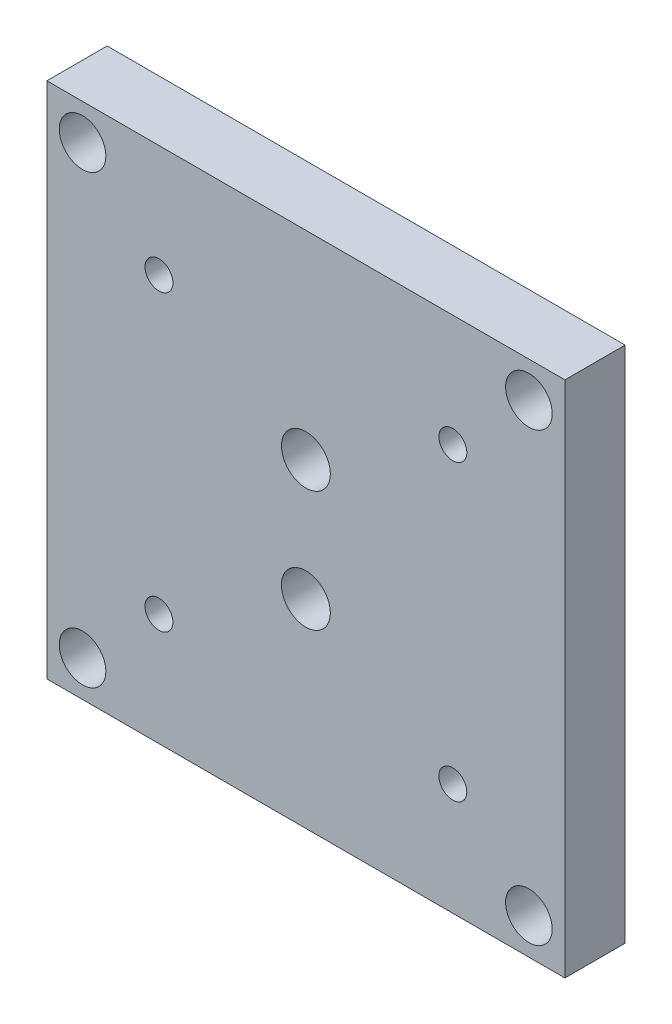
ISO-10303-21;
HEADER;
FILE_DESCRIPTION(('STEP AP214'),'2;1');
FILE_NAME('part.step','',(''),(''),'','','');
FILE_SCHEMA(('AUTOMOTIVE_DESIGN { 1 0 10303 214 1 1 1 1 }'));
ENDSEC;
DATA;
#1=APPLICATION_CONTEXT('core data for automotive mechanical design processes');
#2=APPLICATION_PROTOCOL_DEFINITION('international standard','automotive_design',2000,#1);
#3=PRODUCT_CONTEXT('',#1,'mechanical');
#4=PRODUCT('Part','Part','',(#3));
#5=PRODUCT_RELATED_PRODUCT_CATEGORY('part','',(#4));
#6=PRODUCT_DEFINITION_FORMATION('','',#4);
#7=PRODUCT_DEFINITION_CONTEXT('part definition',#1,'design');
#8=PRODUCT_DEFINITION('design','',#6,#7);
#9=PRODUCT_DEFINITION_SHAPE('','',#8);
#10=(LENGTH_UNIT() NAMED_UNIT(*) SI_UNIT(.MILLI.,.METRE.));
#11=(NAMED_UNIT(*) PLANE_ANGLE_UNIT() SI_UNIT($,.RADIAN.));
#12=(NAMED_UNIT(*) SI_UNIT($,.STERADIAN.) SOLID_ANGLE_UNIT());
#13=UNCERTAINTY_MEASURE_WITH_UNIT(LENGTH_MEASURE(1.E-05),#10,'distance_accuracy_value','');
#14=(GEOMETRIC_REPRESENTATION_CONTEXT(3) GLOBAL_UNCERTAINTY_ASSIGNED_CONTEXT((#13)) GLOBAL_UNIT_ASSIGNED_CONTEXT((#10,
#11,#12)) REPRESENTATION_CONTEXT('',''));
#15=CARTESIAN_POINT('',(0.,0.,0.));
#16=DIRECTION('',(0.,0.,1.));
#17=DIRECTION('',(1.,0.,0.));
#18=AXIS2_PLACEMENT_3D('',#15,#16,#17);
#19=CARTESIAN_POINT('',(-27.305,27.305,6.35));
#20=DIRECTION('',(1.,0.,0.));
#21=DIRECTION('',(0.,0.,-1.));
#22=AXIS2_PLACEMENT_3D('',#19,#20,#21);
#23=PLANE('',#22);
#24=DIRECTION('',(0.,-1.,0.));
#25=VECTOR('',#24,1.);
#26=CARTESIAN_POINT('',(-27.305,27.305,0.));
#27=LINE('',#26,#25);
#28=CARTESIAN_POINT('',(-27.305,27.305,0.));
#29=VERTEX_POINT('',#28);
#30=CARTESIAN_POINT('',(-27.305,-27.305,0.));
#31=VERTEX_POINT('',#30);
#32=EDGE_CURVE('E95',#29,#31,#27,.T.);
#33=ORIENTED_EDGE('',*,*,#32,.T.);
#34=DIRECTION('',(0.,0.,-1.));
#35=VECTOR('',#34,1.);
#36=CARTESIAN_POINT('',(-27.305,-27.305,6.35));
#37=LINE('',#36,#35);
#38=CARTESIAN_POINT('',(-27.305,-27.305,6.35));
#39=VERTEX_POINT('',#38);
#40=EDGE_CURVE('E11',#39,#31,#37,.T.);
#41=ORIENTED_EDGE('',*,*,#40,.F.);
#42=DIRECTION('',(0.,-1.,0.));
#43=VECTOR('',#42,1.);
#44=CARTESIAN_POINT('',(-27.305,27.305,6.35));
#45=LINE('',#44,#43);
#46=CARTESIAN_POINT('',(-27.305,27.305,6.35));
#47=VERTEX_POINT('',#46);
#48=EDGE_CURVE('E83',#47,#39,#45,.T.);
#49=ORIENTED_EDGE('',*,*,#48,.F.);
#50=DIRECTION('',(0.,0.,-1.));
#51=VECTOR('',#50,1.);
#52=CARTESIAN_POINT('',(-27.305,27.305,6.35));
#53=LINE('',#52,#51);
#54=EDGE_CURVE('E91',#47,#29,#53,.T.);
#55=ORIENTED_EDGE('',*,*,#54,.T.);
#56=EDGE_LOOP('',(#33,#41,#49,#55));
#57=FACE_BOUND('',#56,.T.);
#58=ADVANCED_FACE('F32',(#57),#23,.F.);
#59=CARTESIAN_POINT('',(-27.305,-27.305,6.35));
#60=DIRECTION('',(0.,1.,0.));
#61=DIRECTION('',(0.,0.,1.));
#62=AXIS2_PLACEMENT_3D('',#59,#60,#61);
#63=PLANE('',#62);
#64=DIRECTION('',(1.,0.,0.));
#65=VECTOR('',#64,1.);
#66=CARTESIAN_POINT('',(-27.305,-27.305,0.));
#67=LINE('',#66,#65);
#68=CARTESIAN_POINT('',(27.305,-27.305,0.));
#69=VERTEX_POINT('',#68);
#70=EDGE_CURVE('E87',#31,#69,#67,.T.);
#71=ORIENTED_EDGE('',*,*,#70,.T.);
#72=DIRECTION('',(0.,0.,-1.));
#73=VECTOR('',#72,1.);
#74=CARTESIAN_POINT('',(27.305,-27.305,6.35));
#75=LINE('',#74,#73);
#76=CARTESIAN_POINT('',(27.305,-27.305,6.35));
#77=VERTEX_POINT('',#76);
#78=EDGE_CURVE('E40',#77,#69,#75,.T.);
#79=ORIENTED_EDGE('',*,*,#78,.F.);
#80=DIRECTION('',(1.,0.,0.));
#81=VECTOR('',#80,1.);
#82=CARTESIAN_POINT('',(-27.305,-27.305,6.35));
#83=LINE('',#82,#81);
#84=EDGE_CURVE('E78',#39,#77,#83,.T.);
#85=ORIENTED_EDGE('',*,*,#84,.F.);
#86=ORIENTED_EDGE('',*,*,#40,.T.);
#87=EDGE_LOOP('',(#71,#79,#85,#86));
#88=FACE_BOUND('',#87,.T.);
#89=ADVANCED_FACE('F86',(#88),#63,.F.);
#90=CARTESIAN_POINT('',(27.305,27.305,6.35));
#91=DIRECTION('',(-1.,0.,0.));
#92=DIRECTION('',(0.,0.,1.));
#93=AXIS2_PLACEMENT_3D('',#90,#91,#92);
#94=PLANE('',#93);
#95=DIRECTION('',(0.,1.,0.));
#96=VECTOR('',#95,1.);
#97=CARTESIAN_POINT('',(27.305,27.305,0.));
#98=LINE('',#97,#96);
#99=CARTESIAN_POINT('',(27.305,27.305,0.));
#100=VERTEX_POINT('',#99);
#101=EDGE_CURVE('E65',#69,#100,#98,.T.);
#102=ORIENTED_EDGE('',*,*,#101,.T.);
#103=DIRECTION('',(0.,0.,-1.));
#104=VECTOR('',#103,1.);
#105=CARTESIAN_POINT('',(27.305,27.305,6.35));
#106=LINE('',#105,#104);
#107=CARTESIAN_POINT('',(27.305,27.305,6.35));
#108=VERTEX_POINT('',#107);
#109=EDGE_CURVE('E88',#108,#100,#106,.T.);
#110=ORIENTED_EDGE('',*,*,#109,.F.);
#111=DIRECTION('',(0.,1.,0.));
#112=VECTOR('',#111,1.);
#113=CARTESIAN_POINT('',(27.305,27.305,6.35));
#114=LINE('',#113,#112);
#115=EDGE_CURVE('E81',#77,#108,#114,.T.);
#116=ORIENTED_EDGE('',*,*,#115,.F.);
#117=ORIENTED_EDGE('',*,*,#78,.T.);
#118=EDGE_LOOP('',(#102,#110,#116,#117));
#119=FACE_BOUND('',#118,.T.);
#120=ADVANCED_FACE('F89',(#119),#94,.F.);
#121=CARTESIAN_POINT('',(-27.305,27.305,6.35));
#122=DIRECTION('',(0.,-1.,0.));
#123=DIRECTION('',(0.,0.,-1.));
#124=AXIS2_PLACEMENT_3D('',#121,#122,#123);
#125=PLANE('',#124);
#126=DIRECTION('',(-1.,0.,0.));
#127=VECTOR('',#126,1.);
#128=CARTESIAN_POINT('',(-27.305,27.305,0.));
#129=LINE('',#128,#127);
#130=EDGE_CURVE('E71',#100,#29,#129,.T.);
#131=ORIENTED_EDGE('',*,*,#130,.T.);
#132=ORIENTED_EDGE('',*,*,#54,.F.);
#133=DIRECTION('',(-1.,0.,0.));
#134=VECTOR('',#133,1.);
#135=CARTESIAN_POINT('',(-27.305,27.305,6.35));
#136=LINE('',#135,#134);
#137=EDGE_CURVE('E48',#108,#47,#136,.T.);
#138=ORIENTED_EDGE('',*,*,#137,.F.);
#139=ORIENTED_EDGE('',*,*,#109,.T.);
#140=EDGE_LOOP('',(#131,#132,#138,#139));
#141=FACE_BOUND('',#140,.T.);
#142=ADVANCED_FACE('F103',(#141),#125,.F.);
#143=CARTESIAN_POINT('',(0.,0.,6.35));
#144=DIRECTION('',(0.,0.,1.));
#145=DIRECTION('',(1.,0.,0.));
#146=AXIS2_PLACEMENT_3D('',#143,#144,#145);
#147=PLANE('',#146);
#148=CARTESIAN_POINT('',(0.,-6.35,6.35));
#149=DIRECTION('',(0.,0.,1.));
#150=DIRECTION('',(1.,0.,0.));
#151=AXIS2_PLACEMENT_3D('',#148,#149,#150);
#152=CIRCLE('',#151,2.5781);
#153=CARTESIAN_POINT('',(2.5781,-6.35,6.35));
#154=VERTEX_POINT('',#153);
#155=EDGE_CURVE('E160',#154,#154,#152,.T.);
#156=ORIENTED_EDGE('',*,*,#155,.F.);
#157=EDGE_LOOP('',(#156));
#158=FACE_BOUND('',#157,.T.);
#159=CARTESIAN_POINT('',(0.,6.35,6.35));
#160=DIRECTION('',(0.,0.,1.));
#161=DIRECTION('',(1.,0.,0.));
#162=AXIS2_PLACEMENT_3D('',#159,#160,#161);
#163=CIRCLE('',#162,2.5781);
#164=CARTESIAN_POINT('',(2.5781,6.35,6.35));
#165=VERTEX_POINT('',#164);
#166=EDGE_CURVE('E156',#165,#165,#163,.T.);
#167=ORIENTED_EDGE('',*,*,#166,.F.);
#168=EDGE_LOOP('',(#167));
#169=FACE_BOUND('',#168,.T.);
#170=CARTESIAN_POINT('',(-15.4878830138273,15.494,6.35));
#171=DIRECTION('',(0.,0.,1.));
#172=DIRECTION('',(1.,0.,0.));
#173=AXIS2_PLACEMENT_3D('',#170,#171,#172);
#174=CIRCLE('',#173,1.4732);
#175=CARTESIAN_POINT('',(-14.0146830138273,15.494,6.35));
#176=VERTEX_POINT('',#175);
#177=EDGE_CURVE('E153',#176,#176,#174,.T.);
#178=ORIENTED_EDGE('',*,*,#177,.F.);
#179=EDGE_LOOP('',(#178));
#180=FACE_BOUND('',#179,.T.);
#181=CARTESIAN_POINT('',(15.494,15.4878830138273,6.35));
#182=DIRECTION('',(0.,0.,1.));
#183=DIRECTION('',(1.,0.,0.));
#184=AXIS2_PLACEMENT_3D('',#181,#182,#183);
#185=CIRCLE('',#184,1.4732);
#186=CARTESIAN_POINT('',(16.9672,15.4878830138273,6.35));
#187=VERTEX_POINT('',#186);
#188=EDGE_CURVE('E147',#187,#187,#185,.T.);
#189=ORIENTED_EDGE('',*,*,#188,.F.);
#190=EDGE_LOOP('',(#189));
#191=FACE_BOUND('',#190,.T.);
#192=CARTESIAN_POINT('',(15.4878830138273,-15.494,6.35));
#193=DIRECTION('',(0.,0.,1.));
#194=DIRECTION('',(1.,0.,0.));
#195=AXIS2_PLACEMENT_3D('',#192,#193,#194);
#196=CIRCLE('',#195,1.4732);
#197=CARTESIAN_POINT('',(16.9610830138273,-15.494,6.35));
#198=VERTEX_POINT('',#197);
#199=EDGE_CURVE('E141',#198,#198,#196,.T.);
#200=ORIENTED_EDGE('',*,*,#199,.F.);
#201=EDGE_LOOP('',(#200));
#202=FACE_BOUND('',#201,.T.);
#203=CARTESIAN_POINT('',(-15.494,-15.4878830138273,6.35));
#204=DIRECTION('',(0.,0.,1.));
#205=DIRECTION('',(1.,0.,0.));
#206=AXIS2_PLACEMENT_3D('',#203,#204,#205);
#207=CIRCLE('',#206,1.4732);
#208=CARTESIAN_POINT('',(-14.0208,-15.4878830138273,6.35));
#209=VERTEX_POINT('',#208);
#210=EDGE_CURVE('E135',#209,#209,#207,.T.);
#211=ORIENTED_EDGE('',*,*,#210,.F.);
#212=EDGE_LOOP('',(#211));
#213=FACE_BOUND('',#212,.T.);
#214=CARTESIAN_POINT('',(-23.5458,23.5458,6.35));
#215=DIRECTION('',(0.,0.,1.));
#216=DIRECTION('',(1.,0.,0.));
#217=AXIS2_PLACEMENT_3D('',#214,#215,#216);
#218=CIRCLE('',#217,2.45745);
#219=CARTESIAN_POINT('',(-21.08835,23.5458,6.35));
#220=VERTEX_POINT('',#219);
#221=EDGE_CURVE('E129',#220,#220,#218,.T.);
#222=ORIENTED_EDGE('',*,*,#221,.F.);
#223=EDGE_LOOP('',(#222));
#224=FACE_BOUND('',#223,.T.);
#225=CARTESIAN_POINT('',(23.5107420744024,23.5458000000026,6.35));
#226=DIRECTION('',(0.,0.,1.));
#227=DIRECTION('',(1.,0.,0.));
#228=AXIS2_PLACEMENT_3D('',#225,#226,#227);
#229=CIRCLE('',#228,2.45745);
#230=CARTESIAN_POINT('',(25.9681920744024,23.5458000000026,6.35));
#231=VERTEX_POINT('',#230);
#232=EDGE_CURVE('E123',#231,#231,#229,.T.);
#233=ORIENTED_EDGE('',*,*,#232,.F.);
#234=EDGE_LOOP('',(#233));
#235=FACE_BOUND('',#234,.T.);
#236=CARTESIAN_POINT('',(23.5107420744049,-23.5107420743998,6.35));
#237=DIRECTION('',(0.,0.,1.));
#238=DIRECTION('',(1.,0.,0.));
#239=AXIS2_PLACEMENT_3D('',#236,#237,#238);
#240=CIRCLE('',#239,2.45745);
#241=CARTESIAN_POINT('',(25.9681920744049,-23.5107420743998,6.35));
#242=VERTEX_POINT('',#241);
#243=EDGE_CURVE('E117',#242,#242,#240,.T.);
#244=ORIENTED_EDGE('',*,*,#243,.F.);
#245=EDGE_LOOP('',(#244));
#246=FACE_BOUND('',#245,.T.);
#247=CARTESIAN_POINT('',(-23.5457999999976,-23.5107420744021,6.35));
#248=DIRECTION('',(0.,0.,1.));
#249=DIRECTION('',(1.,0.,0.));
#250=AXIS2_PLACEMENT_3D('',#247,#248,#249);
#251=CIRCLE('',#250,2.45745);
#252=CARTESIAN_POINT('',(-21.0883499999976,-23.5107420744021,6.35));
#253=VERTEX_POINT('',#252);
#254=EDGE_CURVE('E111',#253,#253,#251,.T.);
#255=ORIENTED_EDGE('',*,*,#254,.F.);
#256=EDGE_LOOP('',(#255));
#257=FACE_BOUND('',#256,.T.);
#258=ORIENTED_EDGE('',*,*,#48,.T.);
#259=ORIENTED_EDGE('',*,*,#84,.T.);
#260=ORIENTED_EDGE('',*,*,#115,.T.);
#261=ORIENTED_EDGE('',*,*,#137,.T.);
#262=EDGE_LOOP('',(#258,#259,#260,#261));
#263=FACE_BOUND('',#262,.T.);
#264=ADVANCED_FACE('F79',(#158,#169,#180,#191,#202,#213,#224,#235,#246,#257,#263),#147,.T.);
#265=CARTESIAN_POINT('',(0.,0.,0.));
#266=DIRECTION('',(0.,0.,1.));
#267=DIRECTION('',(1.,0.,0.));
#268=AXIS2_PLACEMENT_3D('',#265,#266,#267);
#269=PLANE('',#268);
#270=CARTESIAN_POINT('',(0.,-6.35,0.));
#271=DIRECTION('',(0.,0.,1.));
#272=DIRECTION('',(1.,0.,0.));
#273=AXIS2_PLACEMENT_3D('',#270,#271,#272);
#274=CIRCLE('',#273,2.5781);
#275=CARTESIAN_POINT('',(2.5781,-6.35,0.));
#276=VERTEX_POINT('',#275);
#277=EDGE_CURVE('E163',#276,#276,#274,.T.);
#278=ORIENTED_EDGE('',*,*,#277,.T.);
#279=EDGE_LOOP('',(#278));
#280=FACE_BOUND('',#279,.T.);
#281=CARTESIAN_POINT('',(0.,6.35,0.));
#282=DIRECTION('',(0.,0.,1.));
#283=DIRECTION('',(1.,0.,0.));
#284=AXIS2_PLACEMENT_3D('',#281,#282,#283);
#285=CIRCLE('',#284,2.5781);
#286=CARTESIAN_POINT('',(2.5781,6.35,0.));
#287=VERTEX_POINT('',#286);
#288=EDGE_CURVE('E157',#287,#287,#285,.T.);
#289=ORIENTED_EDGE('',*,*,#288,.T.);
#290=EDGE_LOOP('',(#289));
#291=FACE_BOUND('',#290,.T.);
#292=CARTESIAN_POINT('',(-15.4878830138273,15.494,0.));
#293=DIRECTION('',(0.,0.,1.));
#294=DIRECTION('',(1.,0.,0.));
#295=AXIS2_PLACEMENT_3D('',#292,#293,#294);
#296=CIRCLE('',#295,1.4732);
#297=CARTESIAN_POINT('',(-14.0146830138273,15.494,0.));
#298=VERTEX_POINT('',#297);
#299=EDGE_CURVE('E150',#298,#298,#296,.T.);
#300=ORIENTED_EDGE('',*,*,#299,.T.);
#301=EDGE_LOOP('',(#300));
#302=FACE_BOUND('',#301,.T.);
#303=CARTESIAN_POINT('',(15.494,15.4878830138273,0.));
#304=DIRECTION('',(0.,0.,1.));
#305=DIRECTION('',(1.,0.,0.));
#306=AXIS2_PLACEMENT_3D('',#303,#304,#305);
#307=CIRCLE('',#306,1.4732);
#308=CARTESIAN_POINT('',(16.9672,15.4878830138273,0.));
#309=VERTEX_POINT('',#308);
#310=EDGE_CURVE('E144',#309,#309,#307,.T.);
#311=ORIENTED_EDGE('',*,*,#310,.T.);
#312=EDGE_LOOP('',(#311));
#313=FACE_BOUND('',#312,.T.);
#314=CARTESIAN_POINT('',(15.4878830138273,-15.494,0.));
#315=DIRECTION('',(0.,0.,1.));
#316=DIRECTION('',(1.,0.,0.));
#317=AXIS2_PLACEMENT_3D('',#314,#315,#316);
#318=CIRCLE('',#317,1.4732);
#319=CARTESIAN_POINT('',(16.9610830138273,-15.494,0.));
#320=VERTEX_POINT('',#319);
#321=EDGE_CURVE('E138',#320,#320,#318,.T.);
#322=ORIENTED_EDGE('',*,*,#321,.T.);
#323=EDGE_LOOP('',(#322));
#324=FACE_BOUND('',#323,.T.);
#325=CARTESIAN_POINT('',(-15.494,-15.4878830138273,0.));
#326=DIRECTION('',(0.,0.,1.));
#327=DIRECTION('',(1.,0.,0.));
#328=AXIS2_PLACEMENT_3D('',#325,#326,#327);
#329=CIRCLE('',#328,1.4732);
#330=CARTESIAN_POINT('',(-14.0208,-15.4878830138273,0.));
#331=VERTEX_POINT('',#330);
#332=EDGE_CURVE('E132',#331,#331,#329,.T.);
#333=ORIENTED_EDGE('',*,*,#332,.T.);
#334=EDGE_LOOP('',(#333));
#335=FACE_BOUND('',#334,.T.);
#336=CARTESIAN_POINT('',(-23.5458,23.5458,0.));
#337=DIRECTION('',(0.,0.,1.));
#338=DIRECTION('',(1.,0.,0.));
#339=AXIS2_PLACEMENT_3D('',#336,#337,#338);
#340=CIRCLE('',#339,2.45745);
#341=CARTESIAN_POINT('',(-21.08835,23.5458,0.));
#342=VERTEX_POINT('',#341);
#343=EDGE_CURVE('E126',#342,#342,#340,.T.);
#344=ORIENTED_EDGE('',*,*,#343,.T.);
#345=EDGE_LOOP('',(#344));
#346=FACE_BOUND('',#345,.T.);
#347=CARTESIAN_POINT('',(23.5107420744024,23.5458000000026,0.));
#348=DIRECTION('',(0.,0.,1.));
#349=DIRECTION('',(1.,0.,0.));
#350=AXIS2_PLACEMENT_3D('',#347,#348,#349);
#351=CIRCLE('',#350,2.45745);
#352=CARTESIAN_POINT('',(25.9681920744024,23.5458000000026,0.));
#353=VERTEX_POINT('',#352);
#354=EDGE_CURVE('E120',#353,#353,#351,.T.);
#355=ORIENTED_EDGE('',*,*,#354,.T.);
#356=EDGE_LOOP('',(#355));
#357=FACE_BOUND('',#356,.T.);
#358=CARTESIAN_POINT('',(23.5107420744049,-23.5107420743998,0.));
#359=DIRECTION('',(0.,0.,1.));
#360=DIRECTION('',(1.,0.,0.));
#361=AXIS2_PLACEMENT_3D('',#358,#359,#360);
#362=CIRCLE('',#361,2.45745);
#363=CARTESIAN_POINT('',(25.9681920744049,-23.5107420743998,0.));
#364=VERTEX_POINT('',#363);
#365=EDGE_CURVE('E114',#364,#364,#362,.T.);
#366=ORIENTED_EDGE('',*,*,#365,.T.);
#367=EDGE_LOOP('',(#366));
#368=FACE_BOUND('',#367,.T.);
#369=CARTESIAN_POINT('',(-23.5457999999976,-23.5107420744021,0.));
#370=DIRECTION('',(0.,0.,1.));
#371=DIRECTION('',(1.,0.,0.));
#372=AXIS2_PLACEMENT_3D('',#369,#370,#371);
#373=CIRCLE('',#372,2.45745);
#374=CARTESIAN_POINT('',(-21.0883499999976,-23.5107420744021,0.));
#375=VERTEX_POINT('',#374);
#376=EDGE_CURVE('E98',#375,#375,#373,.T.);
#377=ORIENTED_EDGE('',*,*,#376,.T.);
#378=EDGE_LOOP('',(#377));
#379=FACE_BOUND('',#378,.T.);
#380=ORIENTED_EDGE('',*,*,#32,.F.);
#381=ORIENTED_EDGE('',*,*,#130,.F.);
#382=ORIENTED_EDGE('',*,*,#101,.F.);
#383=ORIENTED_EDGE('',*,*,#70,.F.);
#384=EDGE_LOOP('',(#380,#381,#382,#383));
#385=FACE_BOUND('',#384,.T.);
#386=ADVANCED_FACE('F106',(#280,#291,#302,#313,#324,#335,#346,#357,#368,#379,#385),#269,.F.);
#387=CARTESIAN_POINT('',(-23.5457999999976,-23.5107420744021,6.35));
#388=DIRECTION('',(0.,0.,1.));
#389=DIRECTION('',(1.,0.,0.));
#390=AXIS2_PLACEMENT_3D('',#387,#388,#389);
#391=CYLINDRICAL_SURFACE('',#390,2.45745);
#392=ORIENTED_EDGE('',*,*,#376,.F.);
#393=EDGE_LOOP('',(#392));
#394=FACE_BOUND('',#393,.T.);
#395=ORIENTED_EDGE('',*,*,#254,.T.);
#396=EDGE_LOOP('',(#395));
#397=FACE_BOUND('',#396,.T.);
#398=ADVANCED_FACE('F193',(#394,#397),#391,.F.);
#399=CARTESIAN_POINT('',(23.5107420744049,-23.5107420743998,6.35));
#400=DIRECTION('',(0.,0.,1.));
#401=DIRECTION('',(1.,0.,0.));
#402=AXIS2_PLACEMENT_3D('',#399,#400,#401);
#403=CYLINDRICAL_SURFACE('',#402,2.45745);
#404=ORIENTED_EDGE('',*,*,#365,.F.);
#405=EDGE_LOOP('',(#404));
#406=FACE_BOUND('',#405,.T.);
#407=ORIENTED_EDGE('',*,*,#243,.T.);
#408=EDGE_LOOP('',(#407));
#409=FACE_BOUND('',#408,.T.);
#410=ADVANCED_FACE('F195',(#406,#409),#403,.F.);
#411=CARTESIAN_POINT('',(23.5107420744024,23.5458000000026,6.35));
#412=DIRECTION('',(0.,0.,1.));
#413=DIRECTION('',(1.,0.,0.));
#414=AXIS2_PLACEMENT_3D('',#411,#412,#413);
#415=CYLINDRICAL_SURFACE('',#414,2.45745);
#416=ORIENTED_EDGE('',*,*,#354,.F.);
#417=EDGE_LOOP('',(#416));
#418=FACE_BOUND('',#417,.T.);
#419=ORIENTED_EDGE('',*,*,#232,.T.);
#420=EDGE_LOOP('',(#419));
#421=FACE_BOUND('',#420,.T.);
#422=ADVANCED_FACE('F202',(#418,#421),#415,.F.);
#423=CARTESIAN_POINT('',(-23.5458,23.5458,6.35));
#424=DIRECTION('',(0.,0.,1.));
#425=DIRECTION('',(1.,0.,0.));
#426=AXIS2_PLACEMENT_3D('',#423,#424,#425);
#427=CYLINDRICAL_SURFACE('',#426,2.45745);
#428=ORIENTED_EDGE('',*,*,#343,.F.);
#429=EDGE_LOOP('',(#428));
#430=FACE_BOUND('',#429,.T.);
#431=ORIENTED_EDGE('',*,*,#221,.T.);
#432=EDGE_LOOP('',(#431));
#433=FACE_BOUND('',#432,.T.);
#434=ADVANCED_FACE('F271',(#430,#433),#427,.F.);
#435=CARTESIAN_POINT('',(-15.494,-15.4878830138273,6.35));
#436=DIRECTION('',(0.,0.,1.));
#437=DIRECTION('',(1.,0.,0.));
#438=AXIS2_PLACEMENT_3D('',#435,#436,#437);
#439=CYLINDRICAL_SURFACE('',#438,1.4732);
#440=ORIENTED_EDGE('',*,*,#332,.F.);
#441=EDGE_LOOP('',(#440));
#442=FACE_BOUND('',#441,.T.);
#443=ORIENTED_EDGE('',*,*,#210,.T.);
#444=EDGE_LOOP('',(#443));
#445=FACE_BOUND('',#444,.T.);
#446=ADVANCED_FACE('F267',(#442,#445),#439,.F.);
#447=CARTESIAN_POINT('',(15.4878830138273,-15.494,6.35));
#448=DIRECTION('',(0.,0.,1.));
#449=DIRECTION('',(1.,0.,0.));
#450=AXIS2_PLACEMENT_3D('',#447,#448,#449);
#451=CYLINDRICAL_SURFACE('',#450,1.4732);
#452=ORIENTED_EDGE('',*,*,#321,.F.);
#453=EDGE_LOOP('',(#452));
#454=FACE_BOUND('',#453,.T.);
#455=ORIENTED_EDGE('',*,*,#199,.T.);
#456=EDGE_LOOP('',(#455));
#457=FACE_BOUND('',#456,.T.);
#458=ADVANCED_FACE('F263',(#454,#457),#451,.F.);
#459=CARTESIAN_POINT('',(15.494,15.4878830138273,6.35));
#460=DIRECTION('',(0.,0.,1.));
#461=DIRECTION('',(1.,0.,0.));
#462=AXIS2_PLACEMENT_3D('',#459,#460,#461);
#463=CYLINDRICAL_SURFACE('',#462,1.4732);
#464=ORIENTED_EDGE('',*,*,#310,.F.);
#465=EDGE_LOOP('',(#464));
#466=FACE_BOUND('',#465,.T.);
#467=ORIENTED_EDGE('',*,*,#188,.T.);
#468=EDGE_LOOP('',(#467));
#469=FACE_BOUND('',#468,.T.);
#470=ADVANCED_FACE('F259',(#466,#469),#463,.F.);
#471=CARTESIAN_POINT('',(-15.4878830138273,15.494,6.35));
#472=DIRECTION('',(0.,0.,1.));
#473=DIRECTION('',(1.,0.,0.));
#474=AXIS2_PLACEMENT_3D('',#471,#472,#473);
#475=CYLINDRICAL_SURFACE('',#474,1.4732);
#476=ORIENTED_EDGE('',*,*,#299,.F.);
#477=EDGE_LOOP('',(#476));
#478=FACE_BOUND('',#477,.T.);
#479=ORIENTED_EDGE('',*,*,#177,.T.);
#480=EDGE_LOOP('',(#479));
#481=FACE_BOUND('',#480,.T.);
#482=ADVANCED_FACE('F242',(#478,#481),#475,.F.);
#483=CARTESIAN_POINT('',(0.,6.35,6.35));
#484=DIRECTION('',(0.,0.,-1.));
#485=DIRECTION('',(-1.,0.,0.));
#486=AXIS2_PLACEMENT_3D('',#483,#484,#485);
#487=CYLINDRICAL_SURFACE('',#486,2.5781);
#488=ORIENTED_EDGE('',*,*,#166,.T.);
#489=EDGE_LOOP('',(#488));
#490=FACE_BOUND('',#489,.T.);
#491=ORIENTED_EDGE('',*,*,#288,.F.);
#492=EDGE_LOOP('',(#491));
#493=FACE_BOUND('',#492,.T.);
#494=ADVANCED_FACE('F237',(#490,#493),#487,.F.);
#495=CARTESIAN_POINT('',(0.,-6.35,6.35));
#496=DIRECTION('',(0.,0.,-1.));
#497=DIRECTION('',(-1.,0.,0.));
#498=AXIS2_PLACEMENT_3D('',#495,#496,#497);
#499=CYLINDRICAL_SURFACE('',#498,2.5781);
#500=ORIENTED_EDGE('',*,*,#155,.T.);
#501=EDGE_LOOP('',(#500));
#502=FACE_BOUND('',#501,.T.);
#503=ORIENTED_EDGE('',*,*,#277,.F.);
#504=EDGE_LOOP('',(#503));
#505=FACE_BOUND('',#504,.T.);
#506=ADVANCED_FACE('F169',(#502,#505),#499,.F.);
#507=CLOSED_SHELL('',(#58,#89,#120,#142,#264,#386,#398,#410,#422,#434,#446,#458,#470,#482,#494,#506));
#508=MANIFOLD_SOLID_BREP('B2',#507);
#509=ADVANCED_BREP_SHAPE_REPRESENTATION('',(#18,#508),#14);
#510=SHAPE_DEFINITION_REPRESENTATION(#9,#509);
ENDSEC;
END-ISO-10303-21;
